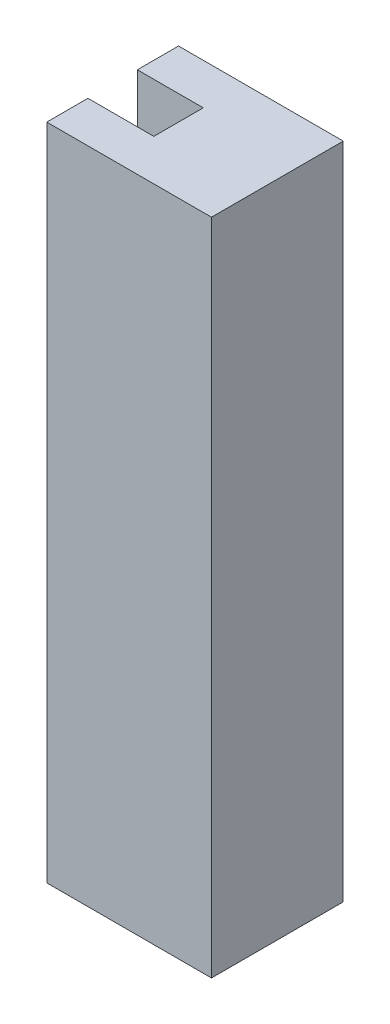
ISO-10303-21;
HEADER;
FILE_DESCRIPTION(('STEP AP214'),'2;1');
FILE_NAME('part.step','',(''),(''),'','','');
FILE_SCHEMA(('AUTOMOTIVE_DESIGN { 1 0 10303 214 1 1 1 1 }'));
ENDSEC;
DATA;
#1=APPLICATION_CONTEXT('core data for automotive mechanical design processes');
#2=APPLICATION_PROTOCOL_DEFINITION('international standard','automotive_design',2000,#1);
#3=PRODUCT_CONTEXT('',#1,'mechanical');
#4=PRODUCT('Part','Part','',(#3));
#5=PRODUCT_RELATED_PRODUCT_CATEGORY('part','',(#4));
#6=PRODUCT_DEFINITION_FORMATION('','',#4);
#7=PRODUCT_DEFINITION_CONTEXT('part definition',#1,'design');
#8=PRODUCT_DEFINITION('design','',#6,#7);
#9=PRODUCT_DEFINITION_SHAPE('','',#8);
#10=(LENGTH_UNIT() NAMED_UNIT(*) SI_UNIT(.MILLI.,.METRE.));
#11=(NAMED_UNIT(*) PLANE_ANGLE_UNIT() SI_UNIT($,.RADIAN.));
#12=(NAMED_UNIT(*) SI_UNIT($,.STERADIAN.) SOLID_ANGLE_UNIT());
#13=UNCERTAINTY_MEASURE_WITH_UNIT(LENGTH_MEASURE(1.E-05),#10,'distance_accuracy_value','');
#14=(GEOMETRIC_REPRESENTATION_CONTEXT(3) GLOBAL_UNCERTAINTY_ASSIGNED_CONTEXT((#13)) GLOBAL_UNIT_ASSIGNED_CONTEXT((#10,
#11,#12)) REPRESENTATION_CONTEXT('',''));
#15=CARTESIAN_POINT('',(0.,0.,0.));
#16=DIRECTION('',(0.,0.,1.));
#17=DIRECTION('',(1.,0.,0.));
#18=AXIS2_PLACEMENT_3D('',#15,#16,#17);
#19=CARTESIAN_POINT('',(0.,80.,0.));
#20=DIRECTION('',(1.,0.,0.));
#21=DIRECTION('',(0.,0.,-1.));
#22=AXIS2_PLACEMENT_3D('',#19,#20,#21);
#23=PLANE('',#22);
#24=DIRECTION('',(0.,0.,1.));
#25=VECTOR('',#24,1.);
#26=CARTESIAN_POINT('',(0.,80.,0.));
#27=LINE('',#26,#25);
#28=CARTESIAN_POINT('',(0.,80.,11.));
#29=VERTEX_POINT('',#28);
#30=CARTESIAN_POINT('',(0.,80.,16.));
#31=VERTEX_POINT('',#30);
#32=EDGE_CURVE('E83',#29,#31,#27,.T.);
#33=ORIENTED_EDGE('',*,*,#32,.F.);
#34=DIRECTION('',(0.,-1.,0.));
#35=VECTOR('',#34,1.);
#36=CARTESIAN_POINT('',(0.,80.,11.));
#37=LINE('',#36,#35);
#38=CARTESIAN_POINT('',(0.,0.,11.));
#39=VERTEX_POINT('',#38);
#40=EDGE_CURVE('E134',#29,#39,#37,.T.);
#41=ORIENTED_EDGE('',*,*,#40,.T.);
#42=DIRECTION('',(0.,0.,1.));
#43=VECTOR('',#42,1.);
#44=CARTESIAN_POINT('',(0.,0.,0.));
#45=LINE('',#44,#43);
#46=CARTESIAN_POINT('',(0.,0.,16.));
#47=VERTEX_POINT('',#46);
#48=EDGE_CURVE('E137',#39,#47,#45,.T.);
#49=ORIENTED_EDGE('',*,*,#48,.T.);
#50=DIRECTION('',(0.,-1.,0.));
#51=VECTOR('',#50,1.);
#52=CARTESIAN_POINT('',(0.,80.,16.));
#53=LINE('',#52,#51);
#54=EDGE_CURVE('E39',#31,#47,#53,.T.);
#55=ORIENTED_EDGE('',*,*,#54,.F.);
#56=EDGE_LOOP('',(#33,#41,#49,#55));
#57=FACE_BOUND('',#56,.T.);
#58=ADVANCED_FACE('F31',(#57),#23,.F.);
#59=CARTESIAN_POINT('',(0.,0.,0.));
#60=VERTEX_POINT('',#59);
#61=CARTESIAN_POINT('',(0.,0.,5.));
#62=VERTEX_POINT('',#61);
#63=EDGE_CURVE('E146',#60,#62,#45,.T.);
#64=ORIENTED_EDGE('',*,*,#63,.T.);
#65=DIRECTION('',(0.,1.,0.));
#66=VECTOR('',#65,1.);
#67=CARTESIAN_POINT('',(0.,80.,5.));
#68=LINE('',#67,#66);
#69=CARTESIAN_POINT('',(0.,80.,5.));
#70=VERTEX_POINT('',#69);
#71=EDGE_CURVE('E46',#62,#70,#68,.T.);
#72=ORIENTED_EDGE('',*,*,#71,.T.);
#73=CARTESIAN_POINT('',(0.,80.,0.));
#74=VERTEX_POINT('',#73);
#75=EDGE_CURVE('E138',#74,#70,#27,.T.);
#76=ORIENTED_EDGE('',*,*,#75,.F.);
#77=DIRECTION('',(0.,-1.,0.));
#78=VECTOR('',#77,1.);
#79=CARTESIAN_POINT('',(0.,80.,0.));
#80=LINE('',#79,#78);
#81=EDGE_CURVE('E145',#74,#60,#80,.T.);
#82=ORIENTED_EDGE('',*,*,#81,.T.);
#83=EDGE_LOOP('',(#64,#72,#76,#82));
#84=FACE_BOUND('',#83,.T.);
#85=ADVANCED_FACE('F33',(#84),#23,.F.);
#86=CARTESIAN_POINT('',(0.,80.,16.));
#87=DIRECTION('',(0.,0.,-1.));
#88=DIRECTION('',(-1.,0.,0.));
#89=AXIS2_PLACEMENT_3D('',#86,#87,#88);
#90=PLANE('',#89);
#91=DIRECTION('',(1.,0.,0.));
#92=VECTOR('',#91,1.);
#93=CARTESIAN_POINT('',(0.,0.,16.));
#94=LINE('',#93,#92);
#95=CARTESIAN_POINT('',(20.,0.,16.));
#96=VERTEX_POINT('',#95);
#97=EDGE_CURVE('E148',#47,#96,#94,.T.);
#98=ORIENTED_EDGE('',*,*,#97,.T.);
#99=DIRECTION('',(0.,-1.,0.));
#100=VECTOR('',#99,1.);
#101=CARTESIAN_POINT('',(20.,80.,16.));
#102=LINE('',#101,#100);
#103=CARTESIAN_POINT('',(20.,80.,16.));
#104=VERTEX_POINT('',#103);
#105=EDGE_CURVE('E156',#104,#96,#102,.T.);
#106=ORIENTED_EDGE('',*,*,#105,.F.);
#107=DIRECTION('',(1.,0.,0.));
#108=VECTOR('',#107,1.);
#109=CARTESIAN_POINT('',(0.,80.,16.));
#110=LINE('',#109,#108);
#111=EDGE_CURVE('E140',#31,#104,#110,.T.);
#112=ORIENTED_EDGE('',*,*,#111,.F.);
#113=ORIENTED_EDGE('',*,*,#54,.T.);
#114=EDGE_LOOP('',(#98,#106,#112,#113));
#115=FACE_BOUND('',#114,.T.);
#116=ADVANCED_FACE('F161',(#115),#90,.F.);
#117=CARTESIAN_POINT('',(20.,80.,0.));
#118=DIRECTION('',(-1.,0.,0.));
#119=DIRECTION('',(0.,0.,1.));
#120=AXIS2_PLACEMENT_3D('',#117,#118,#119);
#121=PLANE('',#120);
#122=DIRECTION('',(0.,0.,-1.));
#123=VECTOR('',#122,1.);
#124=CARTESIAN_POINT('',(20.,0.,0.));
#125=LINE('',#124,#123);
#126=CARTESIAN_POINT('',(20.,0.,0.));
#127=VERTEX_POINT('',#126);
#128=EDGE_CURVE('E150',#96,#127,#125,.T.);
#129=ORIENTED_EDGE('',*,*,#128,.T.);
#130=DIRECTION('',(0.,-1.,0.));
#131=VECTOR('',#130,1.);
#132=CARTESIAN_POINT('',(20.,80.,0.));
#133=LINE('',#132,#131);
#134=CARTESIAN_POINT('',(20.,80.,0.));
#135=VERTEX_POINT('',#134);
#136=EDGE_CURVE('E154',#135,#127,#133,.T.);
#137=ORIENTED_EDGE('',*,*,#136,.F.);
#138=DIRECTION('',(0.,0.,-1.));
#139=VECTOR('',#138,1.);
#140=CARTESIAN_POINT('',(20.,80.,0.));
#141=LINE('',#140,#139);
#142=EDGE_CURVE('E142',#104,#135,#141,.T.);
#143=ORIENTED_EDGE('',*,*,#142,.F.);
#144=ORIENTED_EDGE('',*,*,#105,.T.);
#145=EDGE_LOOP('',(#129,#137,#143,#144));
#146=FACE_BOUND('',#145,.T.);
#147=ADVANCED_FACE('F168',(#146),#121,.F.);
#148=CARTESIAN_POINT('',(0.,80.,0.));
#149=DIRECTION('',(0.,0.,1.));
#150=DIRECTION('',(1.,0.,0.));
#151=AXIS2_PLACEMENT_3D('',#148,#149,#150);
#152=PLANE('',#151);
#153=DIRECTION('',(-1.,0.,0.));
#154=VECTOR('',#153,1.);
#155=CARTESIAN_POINT('',(0.,0.,0.));
#156=LINE('',#155,#154);
#157=EDGE_CURVE('E76',#127,#60,#156,.T.);
#158=ORIENTED_EDGE('',*,*,#157,.T.);
#159=ORIENTED_EDGE('',*,*,#81,.F.);
#160=DIRECTION('',(-1.,0.,0.));
#161=VECTOR('',#160,1.);
#162=CARTESIAN_POINT('',(0.,80.,0.));
#163=LINE('',#162,#161);
#164=EDGE_CURVE('E55',#135,#74,#163,.T.);
#165=ORIENTED_EDGE('',*,*,#164,.F.);
#166=ORIENTED_EDGE('',*,*,#136,.T.);
#167=EDGE_LOOP('',(#158,#159,#165,#166));
#168=FACE_BOUND('',#167,.T.);
#169=ADVANCED_FACE('F170',(#168),#152,.F.);
#170=CARTESIAN_POINT('',(0.,80.,16.));
#171=DIRECTION('',(0.,1.,0.));
#172=DIRECTION('',(0.,0.,1.));
#173=AXIS2_PLACEMENT_3D('',#170,#171,#172);
#174=PLANE('',#173);
#175=DIRECTION('',(1.,0.,0.));
#176=VECTOR('',#175,1.);
#177=CARTESIAN_POINT('',(-5.09299875683184,80.,11.));
#178=LINE('',#177,#176);
#179=CARTESIAN_POINT('',(8.,80.,11.));
#180=VERTEX_POINT('',#179);
#181=EDGE_CURVE('E125',#29,#180,#178,.T.);
#182=ORIENTED_EDGE('',*,*,#181,.F.);
#183=ORIENTED_EDGE('',*,*,#32,.T.);
#184=ORIENTED_EDGE('',*,*,#111,.T.);
#185=ORIENTED_EDGE('',*,*,#142,.T.);
#186=ORIENTED_EDGE('',*,*,#164,.T.);
#187=ORIENTED_EDGE('',*,*,#75,.T.);
#188=DIRECTION('',(-1.,0.,0.));
#189=VECTOR('',#188,1.);
#190=CARTESIAN_POINT('',(-5.09299875683184,80.,5.));
#191=LINE('',#190,#189);
#192=CARTESIAN_POINT('',(8.,80.,5.));
#193=VERTEX_POINT('',#192);
#194=EDGE_CURVE('E127',#193,#70,#191,.T.);
#195=ORIENTED_EDGE('',*,*,#194,.F.);
#196=DIRECTION('',(0.,0.,-1.));
#197=VECTOR('',#196,1.);
#198=CARTESIAN_POINT('',(8.,80.,5.));
#199=LINE('',#198,#197);
#200=EDGE_CURVE('E113',#180,#193,#199,.T.);
#201=ORIENTED_EDGE('',*,*,#200,.F.);
#202=EDGE_LOOP('',(#182,#183,#184,#185,#186,#187,#195,#201));
#203=FACE_BOUND('',#202,.T.);
#204=ADVANCED_FACE('F173',(#203),#174,.T.);
#205=CARTESIAN_POINT('',(0.,0.,16.));
#206=DIRECTION('',(0.,1.,0.));
#207=DIRECTION('',(0.,0.,1.));
#208=AXIS2_PLACEMENT_3D('',#205,#206,#207);
#209=PLANE('',#208);
#210=ORIENTED_EDGE('',*,*,#48,.F.);
#211=DIRECTION('',(1.,0.,0.));
#212=VECTOR('',#211,1.);
#213=CARTESIAN_POINT('',(0.,0.,11.));
#214=LINE('',#213,#212);
#215=CARTESIAN_POINT('',(8.,0.,11.));
#216=VERTEX_POINT('',#215);
#217=EDGE_CURVE('E11',#39,#216,#214,.T.);
#218=ORIENTED_EDGE('',*,*,#217,.T.);
#219=DIRECTION('',(0.,0.,-1.));
#220=VECTOR('',#219,1.);
#221=CARTESIAN_POINT('',(8.,0.,5.));
#222=LINE('',#221,#220);
#223=CARTESIAN_POINT('',(8.,0.,5.));
#224=VERTEX_POINT('',#223);
#225=EDGE_CURVE('E111',#216,#224,#222,.T.);
#226=ORIENTED_EDGE('',*,*,#225,.T.);
#227=DIRECTION('',(-1.,0.,0.));
#228=VECTOR('',#227,1.);
#229=CARTESIAN_POINT('',(-5.09299875683184,0.,5.));
#230=LINE('',#229,#228);
#231=EDGE_CURVE('E116',#224,#62,#230,.T.);
#232=ORIENTED_EDGE('',*,*,#231,.T.);
#233=ORIENTED_EDGE('',*,*,#63,.F.);
#234=ORIENTED_EDGE('',*,*,#157,.F.);
#235=ORIENTED_EDGE('',*,*,#128,.F.);
#236=ORIENTED_EDGE('',*,*,#97,.F.);
#237=EDGE_LOOP('',(#210,#218,#226,#232,#233,#234,#235,#236));
#238=FACE_BOUND('',#237,.T.);
#239=ADVANCED_FACE('F124',(#238),#209,.F.);
#240=CARTESIAN_POINT('',(-5.09299875683184,0.,11.));
#241=DIRECTION('',(0.,0.,1.));
#242=DIRECTION('',(1.,0.,0.));
#243=AXIS2_PLACEMENT_3D('',#240,#241,#242);
#244=PLANE('',#243);
#245=ORIENTED_EDGE('',*,*,#181,.T.);
#246=DIRECTION('',(0.,1.,0.));
#247=VECTOR('',#246,1.);
#248=CARTESIAN_POINT('',(8.,0.,11.));
#249=LINE('',#248,#247);
#250=EDGE_CURVE('E115',#216,#180,#249,.T.);
#251=ORIENTED_EDGE('',*,*,#250,.F.);
#252=ORIENTED_EDGE('',*,*,#217,.F.);
#253=ORIENTED_EDGE('',*,*,#40,.F.);
#254=EDGE_LOOP('',(#245,#251,#252,#253));
#255=FACE_BOUND('',#254,.T.);
#256=ADVANCED_FACE('F175',(#255),#244,.F.);
#257=CARTESIAN_POINT('',(-5.09299875683184,0.,5.));
#258=DIRECTION('',(0.,0.,-1.));
#259=DIRECTION('',(-1.,0.,0.));
#260=AXIS2_PLACEMENT_3D('',#257,#258,#259);
#261=PLANE('',#260);
#262=ORIENTED_EDGE('',*,*,#231,.F.);
#263=DIRECTION('',(0.,1.,0.));
#264=VECTOR('',#263,1.);
#265=CARTESIAN_POINT('',(8.,0.,5.));
#266=LINE('',#265,#264);
#267=EDGE_CURVE('E107',#224,#193,#266,.T.);
#268=ORIENTED_EDGE('',*,*,#267,.T.);
#269=ORIENTED_EDGE('',*,*,#194,.T.);
#270=ORIENTED_EDGE('',*,*,#71,.F.);
#271=EDGE_LOOP('',(#262,#268,#269,#270));
#272=FACE_BOUND('',#271,.T.);
#273=ADVANCED_FACE('F118',(#272),#261,.F.);
#274=CARTESIAN_POINT('',(8.,0.,5.));
#275=DIRECTION('',(1.,0.,0.));
#276=DIRECTION('',(0.,0.,-1.));
#277=AXIS2_PLACEMENT_3D('',#274,#275,#276);
#278=PLANE('',#277);
#279=ORIENTED_EDGE('',*,*,#200,.T.);
#280=ORIENTED_EDGE('',*,*,#267,.F.);
#281=ORIENTED_EDGE('',*,*,#225,.F.);
#282=ORIENTED_EDGE('',*,*,#250,.T.);
#283=EDGE_LOOP('',(#279,#280,#281,#282));
#284=FACE_BOUND('',#283,.T.);
#285=ADVANCED_FACE('F108',(#284),#278,.F.);
#286=CLOSED_SHELL('',(#58,#85,#116,#147,#169,#204,#239,#256,#273,#285));
#287=MANIFOLD_SOLID_BREP('B2',#286);
#288=ADVANCED_BREP_SHAPE_REPRESENTATION('',(#18,#287),#14);
#289=SHAPE_DEFINITION_REPRESENTATION(#9,#288);
ENDSEC;
END-ISO-10303-21;
